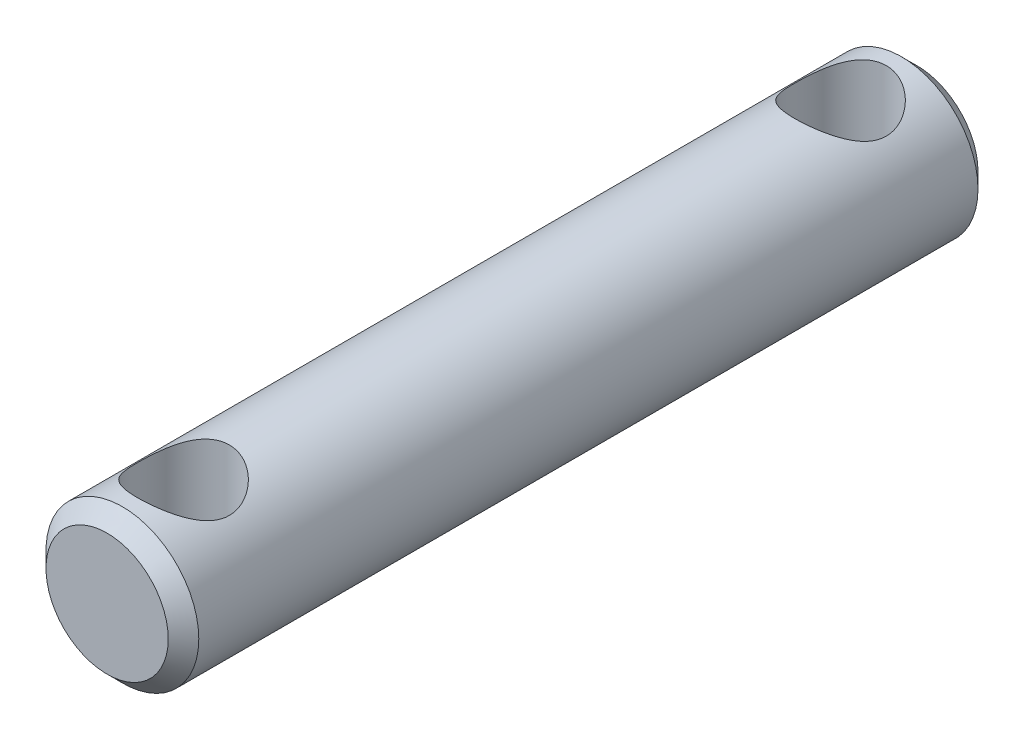
ISO-10303-21;
HEADER;
FILE_DESCRIPTION(('STEP AP214'),'2;1');
FILE_NAME('part.step','',(''),(''),'','','');
FILE_SCHEMA(('AUTOMOTIVE_DESIGN { 1 0 10303 214 1 1 1 1 }'));
ENDSEC;
DATA;
#1=APPLICATION_CONTEXT('core data for automotive mechanical design processes');
#2=APPLICATION_PROTOCOL_DEFINITION('international standard','automotive_design',2000,#1);
#3=PRODUCT_CONTEXT('',#1,'mechanical');
#4=PRODUCT('Part','Part','',(#3));
#5=PRODUCT_RELATED_PRODUCT_CATEGORY('part','',(#4));
#6=PRODUCT_DEFINITION_FORMATION('','',#4);
#7=PRODUCT_DEFINITION_CONTEXT('part definition',#1,'design');
#8=PRODUCT_DEFINITION('design','',#6,#7);
#9=PRODUCT_DEFINITION_SHAPE('','',#8);
#10=(LENGTH_UNIT() NAMED_UNIT(*) SI_UNIT(.MILLI.,.METRE.));
#11=(NAMED_UNIT(*) PLANE_ANGLE_UNIT() SI_UNIT($,.RADIAN.));
#12=(NAMED_UNIT(*) SI_UNIT($,.STERADIAN.) SOLID_ANGLE_UNIT());
#13=UNCERTAINTY_MEASURE_WITH_UNIT(LENGTH_MEASURE(1.E-05),#10,'distance_accuracy_value','');
#14=(GEOMETRIC_REPRESENTATION_CONTEXT(3) GLOBAL_UNCERTAINTY_ASSIGNED_CONTEXT((#13)) GLOBAL_UNIT_ASSIGNED_CONTEXT((#10,
#11,#12)) REPRESENTATION_CONTEXT('',''));
#15=CARTESIAN_POINT('',(0.,0.,0.));
#16=DIRECTION('',(0.,0.,1.));
#17=DIRECTION('',(1.,0.,0.));
#18=AXIS2_PLACEMENT_3D('',#15,#16,#17);
#19=CARTESIAN_POINT('',(0.,0.,53.));
#20=DIRECTION('',(0.,0.,-1.));
#21=DIRECTION('',(-1.,0.,0.));
#22=AXIS2_PLACEMENT_3D('',#19,#20,#21);
#23=CYLINDRICAL_SURFACE('',#22,5.);
#24=CARTESIAN_POINT('',(0.,0.,52.));
#25=DIRECTION('',(0.,0.,1.));
#26=DIRECTION('',(1.,0.,0.));
#27=AXIS2_PLACEMENT_3D('',#24,#25,#26);
#28=CIRCLE('',#27,5.);
#29=CARTESIAN_POINT('',(5.,0.,52.));
#30=VERTEX_POINT('',#29);
#31=EDGE_CURVE('E50',#30,#30,#28,.F.);
#32=ORIENTED_EDGE('',*,*,#31,.T.);
#33=EDGE_LOOP('',(#32));
#34=FACE_BOUND('',#33,.T.);
#35=CARTESIAN_POINT('',(0.,0.,1.));
#36=DIRECTION('',(0.,0.,1.));
#37=DIRECTION('',(1.,0.,0.));
#38=AXIS2_PLACEMENT_3D('',#35,#36,#37);
#39=CIRCLE('',#38,5.);
#40=CARTESIAN_POINT('',(5.,0.,1.));
#41=VERTEX_POINT('',#40);
#42=EDGE_CURVE('E54',#41,#41,#39,.T.);
#43=ORIENTED_EDGE('',*,*,#42,.T.);
#44=EDGE_LOOP('',(#43));
#45=FACE_BOUND('',#44,.T.);
#46=CARTESIAN_POINT('',(0.,-5.,8.));
#47=CARTESIAN_POINT('',(0.0767697294351776,-4.99999907546385,7.99999894375546));
#48=CARTESIAN_POINT('',(0.153562134518394,-4.99822567812271,7.99704640642992));
#49=CARTESIAN_POINT('',(0.306548487758722,-4.99118362570631,7.98528576702026));
#50=CARTESIAN_POINT('',(0.3827420593466,-4.98591292553957,7.97647423881177));
#51=CARTESIAN_POINT('',(0.609808130024635,-4.96499345352549,7.94135144053687));
#52=CARTESIAN_POINT('',(0.758981863291674,-4.94423772571335,7.90635229756656));
#53=CARTESIAN_POINT('',(1.04754167363586,-4.89123238995897,7.81522725649587));
#54=CARTESIAN_POINT('',(1.18697226741343,-4.8590397955111,7.75920607798726));
#55=CARTESIAN_POINT('',(1.45405042800218,-4.7859070225578,7.62827933940295));
#56=CARTESIAN_POINT('',(1.58170090938262,-4.74496901614698,7.55337846763984));
#57=CARTESIAN_POINT('',(1.83260160381824,-4.65410731283371,7.38045034488488));
#58=CARTESIAN_POINT('',(1.95476885986166,-4.60373587041894,7.28109260883346));
#59=CARTESIAN_POINT('',(2.1817645874806,-4.5006087590592,7.06506559280781));
#60=CARTESIAN_POINT('',(2.28657046750404,-4.44785009557539,6.94837412578165));
#61=CARTESIAN_POINT('',(2.48890019509838,-4.33822134833335,6.68415297883109));
#62=CARTESIAN_POINT('',(2.58395539627841,-4.28164035635796,6.53459645787782));
#63=CARTESIAN_POINT('',(2.74722868670786,-4.17876602596121,6.21830685367311));
#64=CARTESIAN_POINT('',(2.81549033155811,-4.13245604474886,6.05160220796684));
#65=CARTESIAN_POINT('',(2.90881204577225,-4.06709259377223,5.74680709834309));
#66=CARTESIAN_POINT('',(2.94032394587637,-4.04415766338644,5.61152800163861));
#67=CARTESIAN_POINT('',(2.98432344587084,-4.01180616527621,5.3363925694786));
#68=CARTESIAN_POINT('',(2.99683469884359,-4.00237279089367,5.19654214669596));
#69=CARTESIAN_POINT('',(3.0021101681982,-3.99841845126251,4.91597700735213));
#70=CARTESIAN_POINT('',(2.99483563630785,-4.00392674756739,4.77526113408812));
#71=CARTESIAN_POINT('',(2.96092124146106,-4.02906522155628,4.49744246488214));
#72=CARTESIAN_POINT('',(2.93426681225442,-4.04870602134772,4.36034246705851));
#73=CARTESIAN_POINT('',(2.86347831933194,-4.09906376582928,4.09493945774946));
#74=CARTESIAN_POINT('',(2.81957453422891,-4.12963433300037,3.96654567700554));
#75=CARTESIAN_POINT('',(2.71590167467071,-4.19854092703026,3.71861023336819));
#76=CARTESIAN_POINT('',(2.6561267841416,-4.23687979941459,3.59907183617097));
#77=CARTESIAN_POINT('',(2.51035773820671,-4.32510698365561,3.35003086234366));
#78=CARTESIAN_POINT('',(2.42160671901868,-4.37584263580749,3.22244000763226));
#79=CARTESIAN_POINT('',(2.22582963207777,-4.4786102252415,2.98265084277988));
#80=CARTESIAN_POINT('',(2.11878609335504,-4.53064336077653,2.87046743459787));
#81=CARTESIAN_POINT('',(1.87159040921357,-4.63871766962913,2.64875774055151));
#82=CARTESIAN_POINT('',(1.72890315178769,-4.69430681953072,2.54178060876264));
#83=CARTESIAN_POINT('',(1.50061053630279,-4.77018325995047,2.40073128727713));
#84=CARTESIAN_POINT('',(1.42209821815681,-4.79423315237467,2.35693586448389));
#85=CARTESIAN_POINT('',(1.26074368673914,-4.83916496756429,2.276281176389));
#86=CARTESIAN_POINT('',(1.17790417501176,-4.86004883588963,2.23941764797919));
#87=CARTESIAN_POINT('',(1.01376371174001,-4.8968267274493,2.17518855714336));
#88=CARTESIAN_POINT('',(0.932690066663962,-4.91295100454953,2.14737343955079));
#89=CARTESIAN_POINT('',(0.76787994973283,-4.94139126794745,2.09866604415476));
#90=CARTESIAN_POINT('',(0.684144997174642,-4.95370938553284,2.07776989155364));
#91=CARTESIAN_POINT('',(0.514744462654428,-4.97416370514887,2.04322814527524));
#92=CARTESIAN_POINT('',(0.429080341969614,-4.98230296820872,2.02957724417139));
#93=CARTESIAN_POINT('',(0.25662174659221,-4.99415996414414,2.00973381560979));
#94=CARTESIAN_POINT('',(0.169827432617763,-4.99787831889699,2.00354023914868));
#95=CARTESIAN_POINT('',(-0.0673242571106388,-5.00179157954795,1.99700732971637));
#96=CARTESIAN_POINT('',(-0.218056842610657,-4.99746512571837,2.0041884543694));
#97=CARTESIAN_POINT('',(-0.515686907628992,-4.97557955020067,2.0408455417291));
#98=CARTESIAN_POINT('',(-0.662584464852962,-4.95802069684413,2.07032105234186));
#99=CARTESIAN_POINT('',(-0.945142599254809,-4.91189447655688,2.14908845918427));
#100=CARTESIAN_POINT('',(-1.08098954856943,-4.88360514429733,2.19788112659201));
#101=CARTESIAN_POINT('',(-1.34253345184752,-4.81827798628348,2.31335432420091));
#102=CARTESIAN_POINT('',(-1.46822839746276,-4.78123843515362,2.38003838259407));
#103=CARTESIAN_POINT('',(-1.7200119213015,-4.69690981059278,2.53711409097797));
#104=CARTESIAN_POINT('',(-1.84478813824221,-4.6489560240695,2.62924769383748));
#105=CARTESIAN_POINT('',(-2.07805222548221,-4.54948534225871,2.83078275125476));
#106=CARTESIAN_POINT('',(-2.18652085154155,-4.49796434043363,2.94020429960271));
#107=CARTESIAN_POINT('',(-2.39863988264157,-4.38890846835682,3.18982079149316));
#108=CARTESIAN_POINT('',(-2.49982037884171,-4.33146483230154,3.33216777394304));
#109=CARTESIAN_POINT('',(-2.67690479207534,-4.22432364395571,3.63443204612756));
#110=CARTESIAN_POINT('',(-2.75283533845461,-4.1746179606141,3.79433058715125));
#111=CARTESIAN_POINT('',(-2.86285157351705,-4.09969818429267,4.09248604511072));
#112=CARTESIAN_POINT('',(-2.90243250662612,-4.07151318633888,4.22796062464204));
#113=CARTESIAN_POINT('',(-2.96227327821696,-4.02819211510625,4.50506415623523));
#114=CARTESIAN_POINT('',(-2.98255990395067,-4.01303795327896,4.64668428945152));
#115=CARTESIAN_POINT('',(-3.00268261034205,-3.99800893189923,4.93275389439522));
#116=CARTESIAN_POINT('',(-3.00244179030844,-3.99819152744817,5.0772119782483));
#117=CARTESIAN_POINT('',(-2.98132945103104,-4.01395435932838,5.3637888743464));
#118=CARTESIAN_POINT('',(-2.9604467136959,-4.02954296823693,5.50590637187481));
#119=CARTESIAN_POINT('',(-2.90080351212232,-4.07266369966217,5.7769768239951));
#120=CARTESIAN_POINT('',(-2.86295284328647,-4.0995842171557,5.90623414792436));
#121=CARTESIAN_POINT('',(-2.7712647351203,-4.1621100581661,6.15667454965315));
#122=CARTESIAN_POINT('',(-2.71742127517719,-4.19771865147484,6.27785456561299));
#123=CARTESIAN_POINT('',(-2.58578536859697,-4.28025972950371,6.52863953945999));
#124=CARTESIAN_POINT('',(-2.50558518231555,-4.32809142579694,6.65668150821477));
#125=CARTESIAN_POINT('',(-2.32751213746956,-4.42640286674055,6.8987608453066));
#126=CARTESIAN_POINT('',(-2.22962472612066,-4.47688476749088,7.01278655047955));
#127=CARTESIAN_POINT('',(-2.00020353552555,-4.58451238270361,7.24269884332947));
#128=CARTESIAN_POINT('',(-1.86578571790513,-4.64140045738634,7.35584987986161));
#129=CARTESIAN_POINT('',(-1.57689277813435,-4.74731429537958,7.55820798604814));
#130=CARTESIAN_POINT('',(-1.42241049573675,-4.79633723789531,7.64740647291971));
#131=CARTESIAN_POINT('',(-1.18102189661684,-4.85920558314903,7.75912447419053));
#132=CARTESIAN_POINT('',(-1.10025014285134,-4.87817139185349,7.79233599596449));
#133=CARTESIAN_POINT('',(-0.935442217988376,-4.91243413775203,7.85177213814346));
#134=CARTESIAN_POINT('',(-0.85140798478809,-4.9277332153652,7.87800083570093));
#135=CARTESIAN_POINT('',(-0.681001816074554,-4.95415527987996,7.92300944207575));
#136=CARTESIAN_POINT('',(-0.59463750060928,-4.9652904423195,7.9418110773033));
#137=CARTESIAN_POINT('',(-0.42018374602075,-4.98308318645254,7.97174435532299));
#138=CARTESIAN_POINT('',(-0.332095806784385,-4.98974449723791,7.98288238615331));
#139=CARTESIAN_POINT('',(-0.203123929661327,-4.99603728421477,7.99339168380533));
#140=CARTESIAN_POINT('',(-0.162556281113478,-4.99752198179196,7.99586843045399));
#141=CARTESIAN_POINT('',(-0.0813278781867589,-4.99950360169341,7.99917289691394));
#142=CARTESIAN_POINT('',(-0.0406671206271639,-5.00000048975323,8.00000055952293));
#143=CARTESIAN_POINT('',(0.,-5.,8.));
#144=B_SPLINE_CURVE_WITH_KNOTS('',3,(#46,#47,#48,#49,#50,#51,#52,#53,#54,#55,#56,#57,#58,#59,
#60,#61,#62,#63,#64,#65,#66,#67,#68,#69,#70,#71,#72,#73,#74,#75,#76,#77,#78,#79,#80,#81,#82,#83,
#84,#85,#86,#87,#88,#89,#90,#91,#92,#93,#94,#95,#96,#97,#98,#99,#100,#101,#102,#103,#104,#105,
#106,#107,#108,#109,#110,#111,#112,#113,#114,#115,#116,#117,#118,#119,#120,#121,#122,#123,#124,
#125,#126,#127,#128,#129,#130,#131,#132,#133,#134,#135,#136,#137,#138,#139,#140,#141,#142,#143),
.UNSPECIFIED.,.T.,.F.,(4,2,2,2,2,2,2,2,2,2,2,2,2,2,2,2,2,2,2,2,2,2,2,2,2,2,2,2,2,2,2,2,2,2,2,2,
2,2,2,2,2,2,2,2,2,2,2,2,4),(0.,0.230263300595003,0.4606613693334,0.922002149276127,
1.38107466343613,1.84003329022065,2.33408870888555,2.82878205293211,3.38413315803225,
3.93857770807794,4.35913349134877,4.77916531256766,5.20002031165062,5.62119195971355,
6.03692224610024,6.45280509043347,6.94139679873936,7.43045779030959,7.98767605192993,
8.26653157143431,8.54521503013734,8.80648473589064,9.06760787545943,9.32853946730961,
9.58943435026958,10.0398406663534,10.490237849174,10.9296843257003,11.3692175250854,
11.8543559282721,12.3400624135416,12.8890638604651,13.437484464234,13.8674843581987,
14.2968863865712,14.7278971274535,15.1591422350194,15.5696105785277,15.9802336423656,
16.4539008129506,16.927959499309,17.4794148474152,18.0310675325446,18.2988384573895,
18.5664526907294,18.8332781687618,19.0998809626714,19.221853785686,19.3438308395353),.UNSPECIFIED.);
#145=CARTESIAN_POINT('',(0.,-5.,8.));
#146=VERTEX_POINT('',#145);
#147=EDGE_CURVE('E64',#146,#146,#144,.T.);
#148=ORIENTED_EDGE('',*,*,#147,.T.);
#149=EDGE_LOOP('',(#148));
#150=FACE_BOUND('',#149,.T.);
#151=CARTESIAN_POINT('',(0.,5.,8.));
#152=CARTESIAN_POINT('',(-0.0767697294351708,4.99999907546385,7.99999894375546));
#153=CARTESIAN_POINT('',(-0.153562134518387,4.99822567812271,7.99704640642992));
#154=CARTESIAN_POINT('',(-0.306548487758715,4.99118362570631,7.98528576702026));
#155=CARTESIAN_POINT('',(-0.382742059346593,4.98591292553957,7.97647423881177));
#156=CARTESIAN_POINT('',(-0.609808130024627,4.96499345352549,7.94135144053687));
#157=CARTESIAN_POINT('',(-0.758981863291667,4.94423772571335,7.90635229756656));
#158=CARTESIAN_POINT('',(-1.04754167363585,4.89123238995897,7.81522725649587));
#159=CARTESIAN_POINT('',(-1.18697226741342,4.8590397955111,7.75920607798726));
#160=CARTESIAN_POINT('',(-1.45405042800218,4.7859070225578,7.62827933940295));
#161=CARTESIAN_POINT('',(-1.58170090938261,4.74496901614699,7.55337846763983));
#162=CARTESIAN_POINT('',(-1.83260160381823,4.65410731283371,7.38045034488488));
#163=CARTESIAN_POINT('',(-1.95476885986166,4.60373587041895,7.28109260883345));
#164=CARTESIAN_POINT('',(-2.18176458748059,4.50060875905921,7.06506559280781));
#165=CARTESIAN_POINT('',(-2.28657046750403,4.4478500955754,6.94837412578164));
#166=CARTESIAN_POINT('',(-2.48890019509837,4.33822134833335,6.68415297883108));
#167=CARTESIAN_POINT('',(-2.5839553962784,4.28164035635797,6.53459645787781));
#168=CARTESIAN_POINT('',(-2.74722868670785,4.17876602596122,6.21830685367311));
#169=CARTESIAN_POINT('',(-2.8154903315581,4.13245604474887,6.05160220796683));
#170=CARTESIAN_POINT('',(-2.90881204577224,4.06709259377224,5.74680709834309));
#171=CARTESIAN_POINT('',(-2.94032394587636,4.04415766338645,5.6115280016386));
#172=CARTESIAN_POINT('',(-2.98432344587082,4.01180616527622,5.33639256947859));
#173=CARTESIAN_POINT('',(-2.99683469884358,4.00237279089368,5.19654214669595));
#174=CARTESIAN_POINT('',(-3.00211016819819,3.99841845126252,4.91597700735212));
#175=CARTESIAN_POINT('',(-2.99483563630784,4.0039267475674,4.77526113408811));
#176=CARTESIAN_POINT('',(-2.96092124146104,4.0290652215563,4.49744246488213));
#177=CARTESIAN_POINT('',(-2.9342668122544,4.04870602134774,4.3603424670585));
#178=CARTESIAN_POINT('',(-2.86347831933192,4.09906376582929,4.09493945774945));
#179=CARTESIAN_POINT('',(-2.81957453422889,4.12963433300038,3.96654567700553));
#180=CARTESIAN_POINT('',(-2.71590167467069,4.19854092703027,3.71861023336818));
#181=CARTESIAN_POINT('',(-2.65612678414158,4.2368797994146,3.59907183617096));
#182=CARTESIAN_POINT('',(-2.51035773820669,4.32510698365562,3.35003086234365));
#183=CARTESIAN_POINT('',(-2.42160671901866,4.37584263580751,3.22244000763225));
#184=CARTESIAN_POINT('',(-2.22582963207775,4.47861022524151,2.98265084277987));
#185=CARTESIAN_POINT('',(-2.11878609335502,4.53064336077654,2.87046743459786));
#186=CARTESIAN_POINT('',(-1.87159040921355,4.63871766962914,2.6487577405515));
#187=CARTESIAN_POINT('',(-1.72890315178766,4.69430681953073,2.54178060876264));
#188=CARTESIAN_POINT('',(-1.50061053630276,4.77018325995048,2.40073128727713));
#189=CARTESIAN_POINT('',(-1.42209821815679,4.79423315237468,2.35693586448389));
#190=CARTESIAN_POINT('',(-1.26074368673911,4.8391649675643,2.27628117638899));
#191=CARTESIAN_POINT('',(-1.17790417501173,4.86004883588963,2.23941764797919));
#192=CARTESIAN_POINT('',(-1.01376371173998,4.89682672744931,2.17518855714336));
#193=CARTESIAN_POINT('',(-0.932690066663935,4.91295100454954,2.14737343955078));
#194=CARTESIAN_POINT('',(-0.767879949732805,4.94139126794745,2.09866604415476));
#195=CARTESIAN_POINT('',(-0.684144997174615,4.95370938553285,2.07776989155363));
#196=CARTESIAN_POINT('',(-0.514744462654401,4.97416370514887,2.04322814527524));
#197=CARTESIAN_POINT('',(-0.429080341969588,4.98230296820873,2.02957724417138));
#198=CARTESIAN_POINT('',(-0.256621746592185,4.99415996414414,2.00973381560979));
#199=CARTESIAN_POINT('',(-0.169827432617738,4.99787831889699,2.00354023914868));
#200=CARTESIAN_POINT('',(0.0673242571106631,5.00179157954795,1.99700732971637));
#201=CARTESIAN_POINT('',(0.218056842610681,4.99746512571837,2.0041884543694));
#202=CARTESIAN_POINT('',(0.515686907629016,4.97557955020066,2.0408455417291));
#203=CARTESIAN_POINT('',(0.662584464852985,4.95802069684413,2.07032105234186));
#204=CARTESIAN_POINT('',(0.945142599254832,4.91189447655688,2.14908845918428));
#205=CARTESIAN_POINT('',(1.08098954856946,4.88360514429732,2.19788112659201));
#206=CARTESIAN_POINT('',(1.34253345184754,4.81827798628348,2.31335432420091));
#207=CARTESIAN_POINT('',(1.46822839746278,4.78123843515362,2.38003838259407));
#208=CARTESIAN_POINT('',(1.72001192130152,4.69690981059277,2.53711409097798));
#209=CARTESIAN_POINT('',(1.84478813824223,4.64895602406949,2.62924769383748));
#210=CARTESIAN_POINT('',(2.07805222548223,4.5494853422587,2.83078275125477));
#211=CARTESIAN_POINT('',(2.18652085154157,4.49796434043362,2.94020429960271));
#212=CARTESIAN_POINT('',(2.39863988264159,4.38890846835681,3.18982079149316));
#213=CARTESIAN_POINT('',(2.49982037884173,4.33146483230153,3.33216777394305));
#214=CARTESIAN_POINT('',(2.67690479207536,4.2243236439557,3.63443204612757));
#215=CARTESIAN_POINT('',(2.75283533845463,4.17461796061409,3.79433058715126));
#216=CARTESIAN_POINT('',(2.86285157351707,4.09969818429265,4.09248604511073));
#217=CARTESIAN_POINT('',(2.90243250662614,4.07151318633887,4.22796062464205));
#218=CARTESIAN_POINT('',(2.96227327821697,4.02819211510624,4.50506415623524));
#219=CARTESIAN_POINT('',(2.98255990395068,4.01303795327895,4.64668428945153));
#220=CARTESIAN_POINT('',(3.00268261034207,3.99800893189921,4.93275389439522));
#221=CARTESIAN_POINT('',(3.00244179030846,3.99819152744816,5.07721197824831));
#222=CARTESIAN_POINT('',(2.98132945103106,4.01395435932837,5.36378887434641));
#223=CARTESIAN_POINT('',(2.96044671369591,4.02954296823692,5.50590637187481));
#224=CARTESIAN_POINT('',(2.90080351212233,4.07266369966216,5.77697682399511));
#225=CARTESIAN_POINT('',(2.86295284328648,4.09958421715569,5.90623414792436));
#226=CARTESIAN_POINT('',(2.77126473512032,4.16211005816609,6.15667454965316));
#227=CARTESIAN_POINT('',(2.7174212751772,4.19771865147484,6.277854565613));
#228=CARTESIAN_POINT('',(2.58578536859698,4.28025972950371,6.52863953945999));
#229=CARTESIAN_POINT('',(2.50558518231556,4.32809142579694,6.65668150821477));
#230=CARTESIAN_POINT('',(2.32751213746957,4.42640286674054,6.8987608453066));
#231=CARTESIAN_POINT('',(2.22962472612067,4.47688476749087,7.01278655047955));
#232=CARTESIAN_POINT('',(2.00020353552556,4.5845123827036,7.24269884332947));
#233=CARTESIAN_POINT('',(1.86578571790514,4.64140045738634,7.35584987986161));
#234=CARTESIAN_POINT('',(1.57689277813436,4.74731429537958,7.55820798604814));
#235=CARTESIAN_POINT('',(1.42241049573676,4.79633723789531,7.64740647291971));
#236=CARTESIAN_POINT('',(1.18102189661685,4.85920558314903,7.75912447419053));
#237=CARTESIAN_POINT('',(1.10025014285135,4.87817139185349,7.79233599596449));
#238=CARTESIAN_POINT('',(0.935442217988387,4.91243413775203,7.85177213814346));
#239=CARTESIAN_POINT('',(0.8514079847881,4.9277332153652,7.87800083570093));
#240=CARTESIAN_POINT('',(0.681001816074565,4.95415527987996,7.92300944207575));
#241=CARTESIAN_POINT('',(0.594637500609292,4.9652904423195,7.9418110773033));
#242=CARTESIAN_POINT('',(0.420183746020761,4.98308318645254,7.97174435532299));
#243=CARTESIAN_POINT('',(0.332095806784394,4.98974449723791,7.98288238615331));
#244=CARTESIAN_POINT('',(0.203123929661335,4.99603728421477,7.99339168380533));
#245=CARTESIAN_POINT('',(0.162556281113486,4.99752198179196,7.99586843045399));
#246=CARTESIAN_POINT('',(0.0813278781867662,4.99950360169341,7.99917289691394));
#247=CARTESIAN_POINT('',(0.040667120627171,5.00000048975323,8.00000055952293));
#248=CARTESIAN_POINT('',(0.,5.,8.));
#249=B_SPLINE_CURVE_WITH_KNOTS('',3,(#151,#152,#153,#154,#155,#156,#157,#158,#159,#160,#161,
#162,#163,#164,#165,#166,#167,#168,#169,#170,#171,#172,#173,#174,#175,#176,#177,#178,#179,#180,
#181,#182,#183,#184,#185,#186,#187,#188,#189,#190,#191,#192,#193,#194,#195,#196,#197,#198,#199,
#200,#201,#202,#203,#204,#205,#206,#207,#208,#209,#210,#211,#212,#213,#214,#215,#216,#217,#218,
#219,#220,#221,#222,#223,#224,#225,#226,#227,#228,#229,#230,#231,#232,#233,#234,#235,#236,#237,
#238,#239,#240,#241,#242,#243,#244,#245,#246,#247,#248),.UNSPECIFIED.,.T.,.F.,(4,2,2,2,2,2,2,2,
2,2,2,2,2,2,2,2,2,2,2,2,2,2,2,2,2,2,2,2,2,2,2,2,2,2,2,2,2,2,2,2,2,2,2,2,2,2,2,2,4),(0.,
0.230263300595003,0.4606613693334,0.922002149276126,1.38107466343613,1.84003329022065,
2.33408870888555,2.82878205293211,3.38413315803225,3.93857770807794,4.35913349134877,
4.77916531256766,5.20002031165062,5.62119195971355,6.03692224610024,6.45280509043347,
6.94139679873936,7.43045779030959,7.98767605192993,8.26653157143432,8.54521503013734,
8.80648473589064,9.06760787545944,9.32853946730961,9.58943435026958,10.0398406663534,
10.490237849174,10.9296843257003,11.3692175250854,11.8543559282721,12.3400624135416,
12.8890638604651,13.437484464234,13.8674843581987,14.2968863865712,14.7278971274535,
15.1591422350194,15.5696105785277,15.9802336423656,16.4539008129506,16.927959499309,
17.4794148474152,18.0310675325446,18.2988384573895,18.5664526907294,18.8332781687618,
19.0998809626714,19.221853785686,19.3438308395353),.UNSPECIFIED.);
#250=CARTESIAN_POINT('',(0.,5.,8.));
#251=VERTEX_POINT('',#250);
#252=EDGE_CURVE('E63',#251,#251,#249,.T.);
#253=ORIENTED_EDGE('',*,*,#252,.T.);
#254=EDGE_LOOP('',(#253));
#255=FACE_BOUND('',#254,.T.);
#256=CARTESIAN_POINT('',(0.,-5.,51.));
#257=CARTESIAN_POINT('',(0.0767697294351778,-4.99999907546385,50.9999989437555));
#258=CARTESIAN_POINT('',(0.153562134518395,-4.99822567812271,50.9970464064299));
#259=CARTESIAN_POINT('',(0.306548487758723,-4.99118362570631,50.9852857670203));
#260=CARTESIAN_POINT('',(0.3827420593466,-4.98591292553957,50.9764742388118));
#261=CARTESIAN_POINT('',(0.609808130024635,-4.96499345352549,50.9413514405369));
#262=CARTESIAN_POINT('',(0.758981863291674,-4.94423772571335,50.9063522975666));
#263=CARTESIAN_POINT('',(1.04754167363586,-4.89123238995897,50.8152272564959));
#264=CARTESIAN_POINT('',(1.18697226741343,-4.8590397955111,50.7592060779873));
#265=CARTESIAN_POINT('',(1.45405042800219,-4.7859070225578,50.628279339403));
#266=CARTESIAN_POINT('',(1.58170090938262,-4.74496901614698,50.5533784676398));
#267=CARTESIAN_POINT('',(1.83260160381824,-4.65410731283371,50.3804503448849));
#268=CARTESIAN_POINT('',(1.95476885986166,-4.60373587041894,50.2810926088335));
#269=CARTESIAN_POINT('',(2.1817645874806,-4.5006087590592,50.0650655928078));
#270=CARTESIAN_POINT('',(2.28657046750404,-4.4478500955754,49.9483741257817));
#271=CARTESIAN_POINT('',(2.48890019509838,-4.33822134833335,49.6841529788311));
#272=CARTESIAN_POINT('',(2.58395539627841,-4.28164035635796,49.5345964578778));
#273=CARTESIAN_POINT('',(2.74722868670786,-4.17876602596121,49.2183068536731));
#274=CARTESIAN_POINT('',(2.81549033155811,-4.13245604474886,49.0516022079668));
#275=CARTESIAN_POINT('',(2.90881204577225,-4.06709259377223,48.7468070983431));
#276=CARTESIAN_POINT('',(2.94032394587638,-4.04415766338644,48.6115280016386));
#277=CARTESIAN_POINT('',(2.98432344587084,-4.01180616527621,48.3363925694786));
#278=CARTESIAN_POINT('',(2.99683469884359,-4.00237279089367,48.196542146696));
#279=CARTESIAN_POINT('',(3.00211016819821,-3.9984184512625,47.9159770073521));
#280=CARTESIAN_POINT('',(2.99483563630786,-4.00392674756738,47.7752611340881));
#281=CARTESIAN_POINT('',(2.96092124146106,-4.02906522155628,47.4974424648821));
#282=CARTESIAN_POINT('',(2.93426681225442,-4.04870602134772,47.3603424670585));
#283=CARTESIAN_POINT('',(2.86347831933194,-4.09906376582928,47.0949394577495));
#284=CARTESIAN_POINT('',(2.81957453422891,-4.12963433300037,46.9665456770055));
#285=CARTESIAN_POINT('',(2.71590167467071,-4.19854092703026,46.7186102333682));
#286=CARTESIAN_POINT('',(2.6561267841416,-4.23687979941459,46.599071836171));
#287=CARTESIAN_POINT('',(2.51035773820672,-4.32510698365561,46.3500308623437));
#288=CARTESIAN_POINT('',(2.42160671901868,-4.37584263580749,46.2224400076323));
#289=CARTESIAN_POINT('',(2.22582963207777,-4.4786102252415,45.9826508427799));
#290=CARTESIAN_POINT('',(2.11878609335505,-4.53064336077653,45.8704674345979));
#291=CARTESIAN_POINT('',(1.87159040921357,-4.63871766962913,45.6487577405515));
#292=CARTESIAN_POINT('',(1.72890315178769,-4.69430681953072,45.5417806087626));
#293=CARTESIAN_POINT('',(1.50061053630279,-4.77018325995047,45.4007312872771));
#294=CARTESIAN_POINT('',(1.42209821815682,-4.79423315237467,45.3569358644839));
#295=CARTESIAN_POINT('',(1.26074368673914,-4.83916496756429,45.276281176389));
#296=CARTESIAN_POINT('',(1.17790417501176,-4.86004883588963,45.2394176479792));
#297=CARTESIAN_POINT('',(1.01376371174001,-4.8968267274493,45.1751885571434));
#298=CARTESIAN_POINT('',(0.932690066663964,-4.91295100454953,45.1473734395508));
#299=CARTESIAN_POINT('',(0.767879949732833,-4.94139126794745,45.0986660441548));
#300=CARTESIAN_POINT('',(0.684144997174644,-4.95370938553284,45.0777698915536));
#301=CARTESIAN_POINT('',(0.514744462654431,-4.97416370514887,45.0432281452752));
#302=CARTESIAN_POINT('',(0.429080341969618,-4.98230296820872,45.0295772441714));
#303=CARTESIAN_POINT('',(0.256621746592215,-4.99415996414414,45.0097338156098));
#304=CARTESIAN_POINT('',(0.169827432617767,-4.99787831889699,45.0035402391487));
#305=CARTESIAN_POINT('',(-0.0673242571106356,-5.00179157954795,44.9970073297164));
#306=CARTESIAN_POINT('',(-0.218056842610654,-4.99746512571837,45.0041884543694));
#307=CARTESIAN_POINT('',(-0.51568690762899,-4.97557955020067,45.0408455417291));
#308=CARTESIAN_POINT('',(-0.662584464852959,-4.95802069684413,45.0703210523419));
#309=CARTESIAN_POINT('',(-0.945142599254807,-4.91189447655688,45.1490884591843));
#310=CARTESIAN_POINT('',(-1.08098954856943,-4.88360514429733,45.197881126592));
#311=CARTESIAN_POINT('',(-1.34253345184752,-4.81827798628348,45.3133543242009));
#312=CARTESIAN_POINT('',(-1.46822839746275,-4.78123843515363,45.3800383825941));
#313=CARTESIAN_POINT('',(-1.7200119213015,-4.69690981059278,45.537114090978));
#314=CARTESIAN_POINT('',(-1.84478813824221,-4.6489560240695,45.6292476938375));
#315=CARTESIAN_POINT('',(-2.07805222548221,-4.54948534225871,45.8307827512548));
#316=CARTESIAN_POINT('',(-2.18652085154155,-4.49796434043363,45.9402042996027));
#317=CARTESIAN_POINT('',(-2.39863988264157,-4.38890846835682,46.1898207914932));
#318=CARTESIAN_POINT('',(-2.49982037884171,-4.33146483230154,46.332167773943));
#319=CARTESIAN_POINT('',(-2.67690479207534,-4.22432364395571,46.6344320461276));
#320=CARTESIAN_POINT('',(-2.75283533845461,-4.1746179606141,46.7943305871513));
#321=CARTESIAN_POINT('',(-2.86285157351706,-4.09969818429267,47.0924860451107));
#322=CARTESIAN_POINT('',(-2.90243250662612,-4.07151318633888,47.227960624642));
#323=CARTESIAN_POINT('',(-2.96227327821696,-4.02819211510625,47.5050641562352));
#324=CARTESIAN_POINT('',(-2.98255990395067,-4.01303795327896,47.6466842894515));
#325=CARTESIAN_POINT('',(-3.00268261034206,-3.99800893189922,47.9327538943952));
#326=CARTESIAN_POINT('',(-3.00244179030845,-3.99819152744817,48.0772119782483));
#327=CARTESIAN_POINT('',(-2.98132945103105,-4.01395435932838,48.3637888743464));
#328=CARTESIAN_POINT('',(-2.9604467136959,-4.02954296823692,48.5059063718748));
#329=CARTESIAN_POINT('',(-2.90080351212232,-4.07266369966217,48.7769768239951));
#330=CARTESIAN_POINT('',(-2.86295284328647,-4.0995842171557,48.9062341479244));
#331=CARTESIAN_POINT('',(-2.7712647351203,-4.1621100581661,49.1566745496532));
#332=CARTESIAN_POINT('',(-2.71742127517719,-4.19771865147485,49.277854565613));
#333=CARTESIAN_POINT('',(-2.58578536859697,-4.28025972950372,49.52863953946));
#334=CARTESIAN_POINT('',(-2.50558518231555,-4.32809142579695,49.6566815082148));
#335=CARTESIAN_POINT('',(-2.32751213746956,-4.42640286674055,49.8987608453066));
#336=CARTESIAN_POINT('',(-2.22962472612066,-4.47688476749088,50.0127865504796));
#337=CARTESIAN_POINT('',(-2.00020353552555,-4.58451238270361,50.2426988433295));
#338=CARTESIAN_POINT('',(-1.86578571790512,-4.64140045738634,50.3558498798616));
#339=CARTESIAN_POINT('',(-1.57689277813434,-4.74731429537958,50.5582079860482));
#340=CARTESIAN_POINT('',(-1.42241049573674,-4.79633723789532,50.6474064729197));
#341=CARTESIAN_POINT('',(-1.18102189661683,-4.85920558314903,50.7591244741905));
#342=CARTESIAN_POINT('',(-1.10025014285133,-4.8781713918535,50.7923359959645));
#343=CARTESIAN_POINT('',(-0.935442217988366,-4.91243413775203,50.8517721381435));
#344=CARTESIAN_POINT('',(-0.85140798478808,-4.9277332153652,50.8780008357009));
#345=CARTESIAN_POINT('',(-0.681001816074546,-4.95415527987996,50.9230094420758));
#346=CARTESIAN_POINT('',(-0.594637500609273,-4.9652904423195,50.9418110773033));
#347=CARTESIAN_POINT('',(-0.420183746020743,-4.98308318645254,50.971744355323));
#348=CARTESIAN_POINT('',(-0.332095806784378,-4.98974449723791,50.9828823861533));
#349=CARTESIAN_POINT('',(-0.203123929661321,-4.99603728421477,50.9933916838053));
#350=CARTESIAN_POINT('',(-0.162556281113474,-4.99752198179196,50.995868430454));
#351=CARTESIAN_POINT('',(-0.0813278781867565,-4.99950360169341,50.9991728969139));
#352=CARTESIAN_POINT('',(-0.0406671206271627,-5.00000048975323,51.0000005595229));
#353=CARTESIAN_POINT('',(0.,-5.,51.));
#354=B_SPLINE_CURVE_WITH_KNOTS('',3,(#256,#257,#258,#259,#260,#261,#262,#263,#264,#265,#266,
#267,#268,#269,#270,#271,#272,#273,#274,#275,#276,#277,#278,#279,#280,#281,#282,#283,#284,#285,
#286,#287,#288,#289,#290,#291,#292,#293,#294,#295,#296,#297,#298,#299,#300,#301,#302,#303,#304,
#305,#306,#307,#308,#309,#310,#311,#312,#313,#314,#315,#316,#317,#318,#319,#320,#321,#322,#323,
#324,#325,#326,#327,#328,#329,#330,#331,#332,#333,#334,#335,#336,#337,#338,#339,#340,#341,#342,
#343,#344,#345,#346,#347,#348,#349,#350,#351,#352,#353),.UNSPECIFIED.,.T.,.F.,(4,2,2,2,2,2,2,2,
2,2,2,2,2,2,2,2,2,2,2,2,2,2,2,2,2,2,2,2,2,2,2,2,2,2,2,2,2,2,2,2,2,2,2,2,2,2,2,2,4),(0.,
0.230263300595004,0.460661369333401,0.922002149276128,1.38107466343613,1.84003329022065,
2.33408870888555,2.82878205293211,3.38413315803226,3.93857770807794,4.35913349134877,
4.77916531256767,5.20002031165064,5.62119195971355,6.03692224610024,6.45280509043347,
6.94139679873936,7.4304577903096,7.98767605192994,8.26653157143432,8.54521503013735,
8.80648473589064,9.06760787545944,9.32853946730961,9.58943435026959,10.0398406663534,
10.490237849174,10.9296843257003,11.3692175250854,11.8543559282721,12.3400624135416,
12.8890638604651,13.437484464234,13.8674843581987,14.2968863865713,14.7278971274535,
15.1591422350194,15.5696105785277,15.9802336423656,16.4539008129506,16.927959499309,
17.4794148474153,18.0310675325446,18.2988384573895,18.5664526907295,18.8332781687618,
19.0998809626714,19.221853785686,19.3438308395353),.UNSPECIFIED.);
#355=CARTESIAN_POINT('',(0.,-5.,51.));
#356=VERTEX_POINT('',#355);
#357=EDGE_CURVE('E73',#356,#356,#354,.T.);
#358=ORIENTED_EDGE('',*,*,#357,.T.);
#359=EDGE_LOOP('',(#358));
#360=FACE_BOUND('',#359,.T.);
#361=CARTESIAN_POINT('',(0.,5.,51.));
#362=CARTESIAN_POINT('',(-0.0767697294351709,4.99999907546385,50.9999989437555));
#363=CARTESIAN_POINT('',(-0.153562134518387,4.99822567812271,50.9970464064299));
#364=CARTESIAN_POINT('',(-0.306548487758715,4.99118362570631,50.9852857670203));
#365=CARTESIAN_POINT('',(-0.382742059346593,4.98591292553957,50.9764742388118));
#366=CARTESIAN_POINT('',(-0.609808130024627,4.96499345352549,50.9413514405369));
#367=CARTESIAN_POINT('',(-0.758981863291667,4.94423772571335,50.9063522975666));
#368=CARTESIAN_POINT('',(-1.04754167363585,4.89123238995897,50.8152272564959));
#369=CARTESIAN_POINT('',(-1.18697226741342,4.8590397955111,50.7592060779873));
#370=CARTESIAN_POINT('',(-1.45405042800218,4.7859070225578,50.628279339403));
#371=CARTESIAN_POINT('',(-1.58170090938261,4.74496901614699,50.5533784676398));
#372=CARTESIAN_POINT('',(-1.83260160381823,4.65410731283371,50.3804503448849));
#373=CARTESIAN_POINT('',(-1.95476885986166,4.60373587041895,50.2810926088335));
#374=CARTESIAN_POINT('',(-2.18176458748059,4.50060875905921,50.0650655928078));
#375=CARTESIAN_POINT('',(-2.28657046750403,4.4478500955754,49.9483741257817));
#376=CARTESIAN_POINT('',(-2.48890019509837,4.33822134833335,49.6841529788311));
#377=CARTESIAN_POINT('',(-2.5839553962784,4.28164035635797,49.5345964578778));
#378=CARTESIAN_POINT('',(-2.74722868670786,4.17876602596121,49.2183068536731));
#379=CARTESIAN_POINT('',(-2.8154903315581,4.13245604474886,49.0516022079668));
#380=CARTESIAN_POINT('',(-2.90881204577224,4.06709259377224,48.7468070983431));
#381=CARTESIAN_POINT('',(-2.94032394587637,4.04415766338645,48.6115280016386));
#382=CARTESIAN_POINT('',(-2.98432344587083,4.01180616527622,48.3363925694786));
#383=CARTESIAN_POINT('',(-2.99683469884358,4.00237279089368,48.196542146696));
#384=CARTESIAN_POINT('',(-3.00211016819819,3.99841845126251,47.9159770073521));
#385=CARTESIAN_POINT('',(-2.99483563630784,4.0039267475674,47.7752611340881));
#386=CARTESIAN_POINT('',(-2.96092124146104,4.02906522155629,47.4974424648821));
#387=CARTESIAN_POINT('',(-2.93426681225441,4.04870602134773,47.3603424670585));
#388=CARTESIAN_POINT('',(-2.86347831933193,4.09906376582929,47.0949394577495));
#389=CARTESIAN_POINT('',(-2.81957453422889,4.12963433300038,46.9665456770055));
#390=CARTESIAN_POINT('',(-2.71590167467069,4.19854092703027,46.7186102333682));
#391=CARTESIAN_POINT('',(-2.65612678414158,4.2368797994146,46.599071836171));
#392=CARTESIAN_POINT('',(-2.51035773820669,4.32510698365562,46.3500308623437));
#393=CARTESIAN_POINT('',(-2.42160671901866,4.3758426358075,46.2224400076323));
#394=CARTESIAN_POINT('',(-2.22582963207775,4.47861022524151,45.9826508427799));
#395=CARTESIAN_POINT('',(-2.11878609335502,4.53064336077654,45.8704674345979));
#396=CARTESIAN_POINT('',(-1.87159040921355,4.63871766962914,45.6487577405515));
#397=CARTESIAN_POINT('',(-1.72890315178767,4.69430681953073,45.5417806087626));
#398=CARTESIAN_POINT('',(-1.50061053630276,4.77018325995048,45.4007312872771));
#399=CARTESIAN_POINT('',(-1.42209821815679,4.79423315237468,45.3569358644839));
#400=CARTESIAN_POINT('',(-1.26074368673911,4.8391649675643,45.276281176389));
#401=CARTESIAN_POINT('',(-1.17790417501173,4.86004883588963,45.2394176479792));
#402=CARTESIAN_POINT('',(-1.01376371173998,4.89682672744931,45.1751885571434));
#403=CARTESIAN_POINT('',(-0.932690066663932,4.91295100454954,45.1473734395508));
#404=CARTESIAN_POINT('',(-0.767879949732802,4.94139126794745,45.0986660441548));
#405=CARTESIAN_POINT('',(-0.684144997174614,4.95370938553285,45.0777698915536));
#406=CARTESIAN_POINT('',(-0.514744462654401,4.97416370514887,45.0432281452752));
#407=CARTESIAN_POINT('',(-0.429080341969588,4.98230296820873,45.0295772441714));
#408=CARTESIAN_POINT('',(-0.256621746592185,4.99415996414414,45.0097338156098));
#409=CARTESIAN_POINT('',(-0.169827432617738,4.99787831889699,45.0035402391487));
#410=CARTESIAN_POINT('',(0.0673242571106639,5.00179157954795,44.9970073297164));
#411=CARTESIAN_POINT('',(0.218056842610683,4.99746512571837,45.0041884543694));
#412=CARTESIAN_POINT('',(0.515686907629018,4.97557955020066,45.0408455417291));
#413=CARTESIAN_POINT('',(0.662584464852986,4.95802069684413,45.0703210523419));
#414=CARTESIAN_POINT('',(0.945142599254832,4.91189447655688,45.1490884591843));
#415=CARTESIAN_POINT('',(1.08098954856946,4.88360514429733,45.197881126592));
#416=CARTESIAN_POINT('',(1.34253345184754,4.81827798628348,45.3133543242009));
#417=CARTESIAN_POINT('',(1.46822839746278,4.78123843515362,45.3800383825941));
#418=CARTESIAN_POINT('',(1.72001192130152,4.69690981059277,45.537114090978));
#419=CARTESIAN_POINT('',(1.84478813824223,4.64895602406949,45.6292476938375));
#420=CARTESIAN_POINT('',(2.07805222548224,4.5494853422587,45.8307827512548));
#421=CARTESIAN_POINT('',(2.18652085154157,4.49796434043362,45.9402042996027));
#422=CARTESIAN_POINT('',(2.3986398826416,4.38890846835681,46.1898207914932));
#423=CARTESIAN_POINT('',(2.49982037884173,4.33146483230153,46.332167773943));
#424=CARTESIAN_POINT('',(2.67690479207537,4.2243236439557,46.6344320461276));
#425=CARTESIAN_POINT('',(2.75283533845463,4.17461796061409,46.7943305871513));
#426=CARTESIAN_POINT('',(2.86285157351707,4.09969818429265,47.0924860451107));
#427=CARTESIAN_POINT('',(2.90243250662614,4.07151318633886,47.2279606246421));
#428=CARTESIAN_POINT('',(2.96227327821698,4.02819211510623,47.5050641562352));
#429=CARTESIAN_POINT('',(2.98255990395068,4.01303795327894,47.6466842894515));
#430=CARTESIAN_POINT('',(3.00268261034207,3.99800893189921,47.9327538943952));
#431=CARTESIAN_POINT('',(3.00244179030846,3.99819152744816,48.0772119782483));
#432=CARTESIAN_POINT('',(2.98132945103106,4.01395435932837,48.3637888743464));
#433=CARTESIAN_POINT('',(2.96044671369592,4.02954296823692,48.5059063718748));
#434=CARTESIAN_POINT('',(2.90080351212233,4.07266369966216,48.7769768239951));
#435=CARTESIAN_POINT('',(2.86295284328648,4.09958421715569,48.9062341479244));
#436=CARTESIAN_POINT('',(2.77126473512031,4.16211005816609,49.1566745496532));
#437=CARTESIAN_POINT('',(2.7174212751772,4.19771865147484,49.277854565613));
#438=CARTESIAN_POINT('',(2.58578536859698,4.28025972950371,49.52863953946));
#439=CARTESIAN_POINT('',(2.50558518231556,4.32809142579694,49.6566815082148));
#440=CARTESIAN_POINT('',(2.32751213746957,4.42640286674054,49.8987608453066));
#441=CARTESIAN_POINT('',(2.22962472612066,4.47688476749088,50.0127865504796));
#442=CARTESIAN_POINT('',(2.00020353552554,4.58451238270361,50.2426988433295));
#443=CARTESIAN_POINT('',(1.86578571790512,4.64140045738634,50.3558498798616));
#444=CARTESIAN_POINT('',(1.57689277813434,4.74731429537958,50.5582079860482));
#445=CARTESIAN_POINT('',(1.42241049573674,4.79633723789532,50.6474064729197));
#446=CARTESIAN_POINT('',(1.18102189661684,4.85920558314903,50.7591244741905));
#447=CARTESIAN_POINT('',(1.10025014285134,4.87817139185349,50.7923359959645));
#448=CARTESIAN_POINT('',(0.935442217988368,4.91243413775203,50.8517721381435));
#449=CARTESIAN_POINT('',(0.851407984788083,4.9277332153652,50.8780008357009));
#450=CARTESIAN_POINT('',(0.681001816074549,4.95415527987996,50.9230094420758));
#451=CARTESIAN_POINT('',(0.594637500609276,4.9652904423195,50.9418110773033));
#452=CARTESIAN_POINT('',(0.420183746020746,4.98308318645254,50.971744355323));
#453=CARTESIAN_POINT('',(0.332095806784381,4.98974449723791,50.9828823861533));
#454=CARTESIAN_POINT('',(0.203123929661324,4.99603728421478,50.9933916838053));
#455=CARTESIAN_POINT('',(0.162556281113478,4.99752198179196,50.995868430454));
#456=CARTESIAN_POINT('',(0.081327878186762,4.99950360169341,50.9991728969139));
#457=CARTESIAN_POINT('',(0.0406671206271689,5.00000048975323,51.0000005595229));
#458=CARTESIAN_POINT('',(0.,5.,51.));
#459=B_SPLINE_CURVE_WITH_KNOTS('',3,(#361,#362,#363,#364,#365,#366,#367,#368,#369,#370,#371,
#372,#373,#374,#375,#376,#377,#378,#379,#380,#381,#382,#383,#384,#385,#386,#387,#388,#389,#390,
#391,#392,#393,#394,#395,#396,#397,#398,#399,#400,#401,#402,#403,#404,#405,#406,#407,#408,#409,
#410,#411,#412,#413,#414,#415,#416,#417,#418,#419,#420,#421,#422,#423,#424,#425,#426,#427,#428,
#429,#430,#431,#432,#433,#434,#435,#436,#437,#438,#439,#440,#441,#442,#443,#444,#445,#446,#447,
#448,#449,#450,#451,#452,#453,#454,#455,#456,#457,#458),.UNSPECIFIED.,.T.,.F.,(4,2,2,2,2,2,2,2,
2,2,2,2,2,2,2,2,2,2,2,2,2,2,2,2,2,2,2,2,2,2,2,2,2,2,2,2,2,2,2,2,2,2,2,2,2,2,2,2,4),(0.,
0.230263300595003,0.4606613693334,0.922002149276126,1.38107466343613,1.84003329022065,
2.33408870888555,2.82878205293211,3.38413315803226,3.93857770807794,4.35913349134878,
4.77916531256766,5.20002031165063,5.62119195971355,6.03692224610025,6.45280509043348,
6.94139679873937,7.4304577903096,7.98767605192994,8.26653157143433,8.54521503013736,
8.80648473589065,9.06760787545944,9.32853946730962,9.58943435026959,10.0398406663534,
10.490237849174,10.9296843257003,11.3692175250854,11.8543559282721,12.3400624135416,
12.8890638604651,13.437484464234,13.8674843581987,14.2968863865713,14.7278971274535,
15.1591422350194,15.5696105785277,15.9802336423656,16.4539008129506,16.9279594993091,
17.4794148474153,18.0310675325446,18.2988384573895,18.5664526907295,18.8332781687618,
19.0998809626714,19.221853785686,19.3438308395353),.UNSPECIFIED.);
#460=CARTESIAN_POINT('',(0.,5.,51.));
#461=VERTEX_POINT('',#460);
#462=EDGE_CURVE('E72',#461,#461,#459,.T.);
#463=ORIENTED_EDGE('',*,*,#462,.T.);
#464=EDGE_LOOP('',(#463));
#465=FACE_BOUND('',#464,.T.);
#466=ADVANCED_FACE('F43',(#34,#45,#150,#255,#360,#465),#23,.T.);
#467=CARTESIAN_POINT('',(0.,0.,53.));
#468=DIRECTION('',(0.,0.,1.));
#469=DIRECTION('',(1.,0.,0.));
#470=AXIS2_PLACEMENT_3D('',#467,#468,#469);
#471=PLANE('',#470);
#472=CARTESIAN_POINT('',(0.,0.,53.));
#473=DIRECTION('',(0.,0.,1.));
#474=DIRECTION('',(1.,0.,0.));
#475=AXIS2_PLACEMENT_3D('',#472,#473,#474);
#476=CIRCLE('',#475,4.);
#477=CARTESIAN_POINT('',(4.,0.,53.));
#478=VERTEX_POINT('',#477);
#479=EDGE_CURVE('E58',#478,#478,#476,.T.);
#480=ORIENTED_EDGE('',*,*,#479,.T.);
#481=EDGE_LOOP('',(#480));
#482=FACE_BOUND('',#481,.T.);
#483=ADVANCED_FACE('F93',(#482),#471,.T.);
#484=CARTESIAN_POINT('',(0.,0.,0.));
#485=DIRECTION('',(0.,0.,1.));
#486=DIRECTION('',(1.,0.,0.));
#487=AXIS2_PLACEMENT_3D('',#484,#485,#486);
#488=PLANE('',#487);
#489=CARTESIAN_POINT('',(0.,0.,0.));
#490=DIRECTION('',(0.,0.,1.));
#491=DIRECTION('',(1.,0.,0.));
#492=AXIS2_PLACEMENT_3D('',#489,#490,#491);
#493=CIRCLE('',#492,4.);
#494=CARTESIAN_POINT('',(4.,0.,0.));
#495=VERTEX_POINT('',#494);
#496=EDGE_CURVE('E12',#495,#495,#493,.F.);
#497=ORIENTED_EDGE('',*,*,#496,.T.);
#498=EDGE_LOOP('',(#497));
#499=FACE_BOUND('',#498,.T.);
#500=ADVANCED_FACE('F91',(#499),#488,.F.);
#501=CARTESIAN_POINT('',(0.,-42.,48.));
#502=DIRECTION('',(0.,1.,0.));
#503=DIRECTION('',(0.,0.,1.));
#504=AXIS2_PLACEMENT_3D('',#501,#502,#503);
#505=CYLINDRICAL_SURFACE('',#504,3.);
#506=ORIENTED_EDGE('',*,*,#357,.F.);
#507=EDGE_LOOP('',(#506));
#508=FACE_BOUND('',#507,.T.);
#509=ORIENTED_EDGE('',*,*,#462,.F.);
#510=EDGE_LOOP('',(#509));
#511=FACE_BOUND('',#510,.T.);
#512=ADVANCED_FACE('F85',(#508,#511),#505,.F.);
#513=CARTESIAN_POINT('',(0.,-42.,5.));
#514=DIRECTION('',(0.,1.,0.));
#515=DIRECTION('',(0.,0.,1.));
#516=AXIS2_PLACEMENT_3D('',#513,#514,#515);
#517=CYLINDRICAL_SURFACE('',#516,3.);
#518=ORIENTED_EDGE('',*,*,#147,.F.);
#519=EDGE_LOOP('',(#518));
#520=FACE_BOUND('',#519,.T.);
#521=ORIENTED_EDGE('',*,*,#252,.F.);
#522=EDGE_LOOP('',(#521));
#523=FACE_BOUND('',#522,.T.);
#524=ADVANCED_FACE('F80',(#520,#523),#517,.F.);
#525=CARTESIAN_POINT('',(0.,0.,53.));
#526=DIRECTION('',(0.,0.,-1.));
#527=DIRECTION('',(-1.,0.,0.));
#528=AXIS2_PLACEMENT_3D('',#525,#526,#527);
#529=CONICAL_SURFACE('',#528,4.,0.785398163397446);
#530=ORIENTED_EDGE('',*,*,#31,.F.);
#531=EDGE_LOOP('',(#530));
#532=FACE_BOUND('',#531,.T.);
#533=ORIENTED_EDGE('',*,*,#479,.F.);
#534=EDGE_LOOP('',(#533));
#535=FACE_BOUND('',#534,.T.);
#536=ADVANCED_FACE('F84',(#532,#535),#529,.T.);
#537=CARTESIAN_POINT('',(0.,0.,1.));
#538=DIRECTION('',(0.,0.,1.));
#539=DIRECTION('',(1.,0.,0.));
#540=AXIS2_PLACEMENT_3D('',#537,#538,#539);
#541=CONICAL_SURFACE('',#540,5.,0.78539816339745);
#542=ORIENTED_EDGE('',*,*,#496,.F.);
#543=EDGE_LOOP('',(#542));
#544=FACE_BOUND('',#543,.T.);
#545=ORIENTED_EDGE('',*,*,#42,.F.);
#546=EDGE_LOOP('',(#545));
#547=FACE_BOUND('',#546,.T.);
#548=ADVANCED_FACE('F45',(#544,#547),#541,.T.);
#549=CLOSED_SHELL('',(#466,#483,#500,#512,#524,#536,#548));
#550=MANIFOLD_SOLID_BREP('B2',#549);
#551=ADVANCED_BREP_SHAPE_REPRESENTATION('',(#18,#550),#14);
#552=SHAPE_DEFINITION_REPRESENTATION(#9,#551);
ENDSEC;
END-ISO-10303-21;
